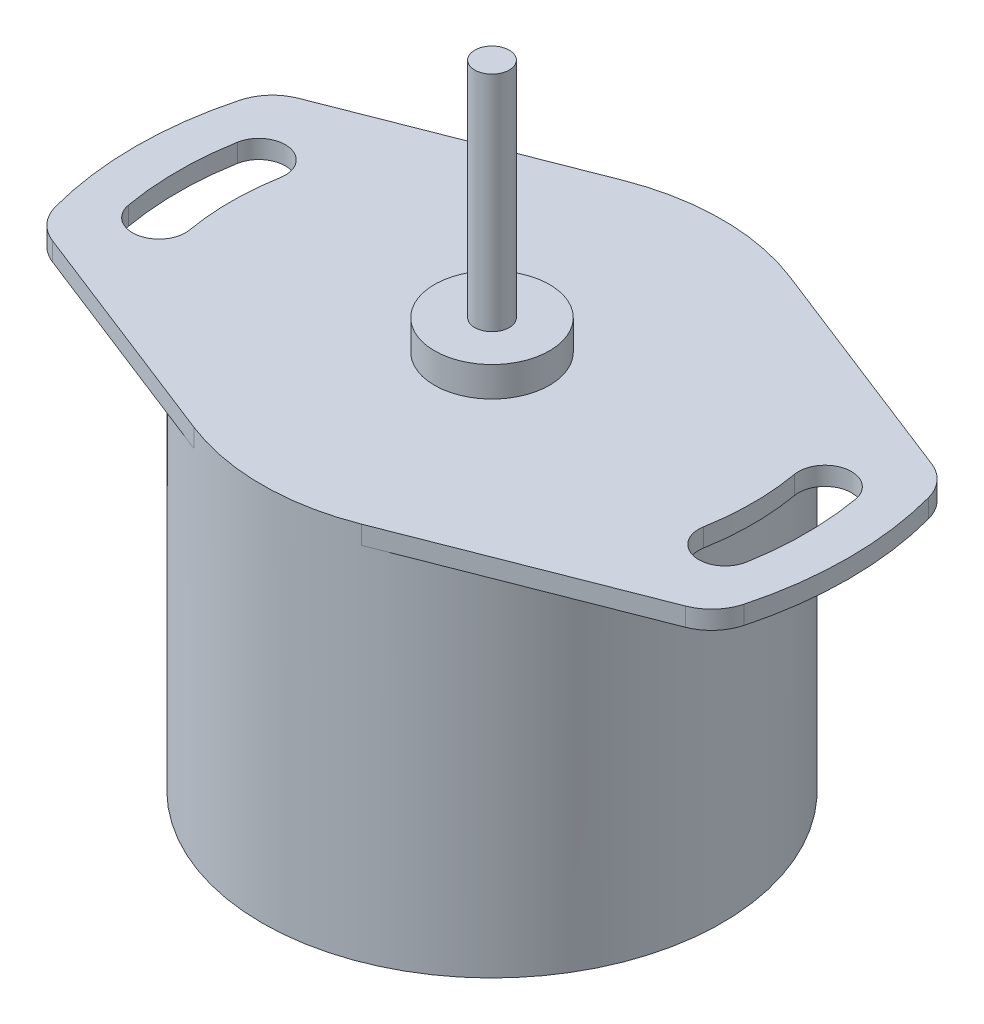
ISO-10303-21;
HEADER;
FILE_DESCRIPTION(('STEP AP214'),'2;1');
FILE_NAME('part.step','',(''),(''),'','','');
FILE_SCHEMA(('AUTOMOTIVE_DESIGN { 1 0 10303 214 1 1 1 1 }'));
ENDSEC;
DATA;
#1=APPLICATION_CONTEXT('core data for automotive mechanical design processes');
#2=APPLICATION_PROTOCOL_DEFINITION('international standard','automotive_design',2000,#1);
#3=PRODUCT_CONTEXT('',#1,'mechanical');
#4=PRODUCT('Part','Part','',(#3));
#5=PRODUCT_RELATED_PRODUCT_CATEGORY('part','',(#4));
#6=PRODUCT_DEFINITION_FORMATION('','',#4);
#7=PRODUCT_DEFINITION_CONTEXT('part definition',#1,'design');
#8=PRODUCT_DEFINITION('design','',#6,#7);
#9=PRODUCT_DEFINITION_SHAPE('','',#8);
#10=(LENGTH_UNIT() NAMED_UNIT(*) SI_UNIT(.MILLI.,.METRE.));
#11=(NAMED_UNIT(*) PLANE_ANGLE_UNIT() SI_UNIT($,.RADIAN.));
#12=(NAMED_UNIT(*) SI_UNIT($,.STERADIAN.) SOLID_ANGLE_UNIT());
#13=UNCERTAINTY_MEASURE_WITH_UNIT(LENGTH_MEASURE(1.E-05),#10,'distance_accuracy_value','');
#14=(GEOMETRIC_REPRESENTATION_CONTEXT(3) GLOBAL_UNCERTAINTY_ASSIGNED_CONTEXT((#13)) GLOBAL_UNIT_ASSIGNED_CONTEXT((#10,
#11,#12)) REPRESENTATION_CONTEXT('',''));
#15=CARTESIAN_POINT('',(0.,0.,0.));
#16=DIRECTION('',(0.,0.,1.));
#17=DIRECTION('',(1.,0.,0.));
#18=AXIS2_PLACEMENT_3D('',#15,#16,#17);
#19=CARTESIAN_POINT('',(0.,-1.3,0.));
#20=DIRECTION('',(0.,-1.,0.));
#21=DIRECTION('',(0.,0.,-1.));
#22=AXIS2_PLACEMENT_3D('',#19,#20,#21);
#23=PLANE('',#22);
#24=CARTESIAN_POINT('',(0.,-1.3,0.));
#25=DIRECTION('',(0.,-1.,0.));
#26=DIRECTION('',(0.,0.,-1.));
#27=AXIS2_PLACEMENT_3D('',#24,#25,#26);
#28=CIRCLE('',#27,3.);
#29=CARTESIAN_POINT('',(0.,-1.3,-3.));
#30=VERTEX_POINT('',#29);
#31=EDGE_CURVE('E278',#30,#30,#28,.T.);
#32=ORIENTED_EDGE('',*,*,#31,.T.);
#33=EDGE_LOOP('',(#32));
#34=FACE_BOUND('',#33,.T.);
#35=CARTESIAN_POINT('',(0.,-1.3,0.));
#36=DIRECTION('',(0.,-1.,0.));
#37=DIRECTION('',(0.,0.,-1.));
#38=AXIS2_PLACEMENT_3D('',#35,#36,#37);
#39=CIRCLE('',#38,0.75);
#40=CARTESIAN_POINT('',(0.,-1.3,-0.75));
#41=VERTEX_POINT('',#40);
#42=EDGE_CURVE('E612',#41,#41,#39,.T.);
#43=ORIENTED_EDGE('',*,*,#42,.F.);
#44=EDGE_LOOP('',(#43));
#45=FACE_BOUND('',#44,.T.);
#46=ADVANCED_FACE('F33',(#34,#45),#23,.T.);
#47=CARTESIAN_POINT('',(0.,17.8,0.));
#48=DIRECTION('',(0.,1.,0.));
#49=DIRECTION('',(0.,0.,1.));
#50=AXIS2_PLACEMENT_3D('',#47,#48,#49);
#51=PLANE('',#50);
#52=CARTESIAN_POINT('',(0.,17.8,0.));
#53=DIRECTION('',(0.,1.,0.));
#54=DIRECTION('',(0.,0.,1.));
#55=AXIS2_PLACEMENT_3D('',#52,#53,#54);
#56=CIRCLE('',#55,2.5);
#57=CARTESIAN_POINT('',(0.,17.8,2.5));
#58=VERTEX_POINT('',#57);
#59=EDGE_CURVE('E207',#58,#58,#56,.T.);
#60=ORIENTED_EDGE('',*,*,#59,.T.);
#61=EDGE_LOOP('',(#60));
#62=FACE_BOUND('',#61,.T.);
#63=CARTESIAN_POINT('',(0.,17.8,0.));
#64=DIRECTION('',(0.,1.,0.));
#65=DIRECTION('',(0.,0.,1.));
#66=AXIS2_PLACEMENT_3D('',#63,#64,#65);
#67=CIRCLE('',#66,0.75);
#68=CARTESIAN_POINT('',(0.,17.8,0.75));
#69=VERTEX_POINT('',#68);
#70=EDGE_CURVE('E611',#69,#69,#67,.T.);
#71=ORIENTED_EDGE('',*,*,#70,.F.);
#72=EDGE_LOOP('',(#71));
#73=FACE_BOUND('',#72,.T.);
#74=ADVANCED_FACE('F416',(#62,#73),#51,.T.);
#75=CARTESIAN_POINT('',(0.,16.5,0.));
#76=DIRECTION('',(0.,1.,0.));
#77=DIRECTION('',(0.,0.,1.));
#78=AXIS2_PLACEMENT_3D('',#75,#76,#77);
#79=PLANE('',#78);
#80=CARTESIAN_POINT('',(0.,16.5,0.));
#81=DIRECTION('',(0.,1.,0.));
#82=DIRECTION('',(0.,0.,1.));
#83=AXIS2_PLACEMENT_3D('',#80,#81,#82);
#84=CIRCLE('',#83,13.65);
#85=CARTESIAN_POINT('',(13.4426258286167,16.5,2.3702976251536));
#86=VERTEX_POINT('',#85);
#87=CARTESIAN_POINT('',(13.4426258286167,16.5,-2.37029762515359));
#88=VERTEX_POINT('',#87);
#89=EDGE_CURVE('E183',#86,#88,#84,.T.);
#90=ORIENTED_EDGE('',*,*,#89,.F.);
#91=CARTESIAN_POINT('',(12.3100969126526,16.5,2.17060222083662));
#92=DIRECTION('',(0.,1.,0.));
#93=DIRECTION('',(0.,0.,1.));
#94=AXIS2_PLACEMENT_3D('',#91,#92,#93);
#95=CIRCLE('',#94,1.15000000000001);
#96=CARTESIAN_POINT('',(11.1775679966886,16.5,1.97090681651966));
#97=VERTEX_POINT('',#96);
#98=EDGE_CURVE('E173',#97,#86,#95,.T.);
#99=ORIENTED_EDGE('',*,*,#98,.F.);
#100=CARTESIAN_POINT('',(0.,16.5,0.));
#101=DIRECTION('',(0.,-1.,0.));
#102=DIRECTION('',(0.,0.,1.));
#103=AXIS2_PLACEMENT_3D('',#100,#101,#102);
#104=CIRCLE('',#103,11.35);
#105=CARTESIAN_POINT('',(11.1775679966886,16.5,-1.97090681651965));
#106=VERTEX_POINT('',#105);
#107=EDGE_CURVE('E200',#106,#97,#104,.T.);
#108=ORIENTED_EDGE('',*,*,#107,.F.);
#109=CARTESIAN_POINT('',(12.3100969126526,16.5,-2.17060222083662));
#110=DIRECTION('',(0.,1.,0.));
#111=DIRECTION('',(0.,0.,1.));
#112=AXIS2_PLACEMENT_3D('',#109,#110,#111);
#113=CIRCLE('',#112,1.15000000000001);
#114=EDGE_CURVE('E198',#88,#106,#113,.T.);
#115=ORIENTED_EDGE('',*,*,#114,.F.);
#116=EDGE_LOOP('',(#90,#99,#108,#115));
#117=FACE_BOUND('',#116,.T.);
#118=DIRECTION('',(-0.93131854557357,0.,0.364205665346835));
#119=VECTOR('',#118,1.);
#120=CARTESIAN_POINT('',(-14.6714007511212,16.5,-5.));
#121=LINE('',#120,#119);
#122=CARTESIAN_POINT('',(-3.64205665346834,16.5,-9.3131854557357));
#123=VERTEX_POINT('',#122);
#124=CARTESIAN_POINT('',(-13.7694767638018,16.5,-5.3527104957323));
#125=VERTEX_POINT('',#124);
#126=EDGE_CURVE('E267',#123,#125,#121,.T.);
#127=ORIENTED_EDGE('',*,*,#126,.T.);
#128=CARTESIAN_POINT('',(-13.0410654331081,16.5,-3.49007340458517));
#129=DIRECTION('',(0.,1.,0.));
#130=DIRECTION('',(0.,0.,1.));
#131=AXIS2_PLACEMENT_3D('',#128,#129,#130);
#132=CIRCLE('',#131,2.);
#133=CARTESIAN_POINT('',(-14.9730751269019,16.5,-4.00712131637556));
#134=VERTEX_POINT('',#133);
#135=EDGE_CURVE('E328',#125,#134,#132,.T.);
#136=ORIENTED_EDGE('',*,*,#135,.T.);
#137=CARTESIAN_POINT('',(0.,16.5,0.));
#138=DIRECTION('',(0.,1.,0.));
#139=DIRECTION('',(0.,0.,1.));
#140=AXIS2_PLACEMENT_3D('',#137,#138,#139);
#141=CIRCLE('',#140,15.5);
#142=CARTESIAN_POINT('',(-14.9730751269019,16.5,4.00712131637556));
#143=VERTEX_POINT('',#142);
#144=EDGE_CURVE('E249',#134,#143,#141,.T.);
#145=ORIENTED_EDGE('',*,*,#144,.T.);
#146=CARTESIAN_POINT('',(-13.0410654331081,16.5,3.49007340458517));
#147=DIRECTION('',(0.,1.,0.));
#148=DIRECTION('',(0.,0.,1.));
#149=AXIS2_PLACEMENT_3D('',#146,#147,#148);
#150=CIRCLE('',#149,2.);
#151=CARTESIAN_POINT('',(-13.7694767638018,16.5,5.3527104957323));
#152=VERTEX_POINT('',#151);
#153=EDGE_CURVE('E322',#143,#152,#150,.T.);
#154=ORIENTED_EDGE('',*,*,#153,.T.);
#155=DIRECTION('',(0.93131854557357,0.,0.364205665346835));
#156=VECTOR('',#155,1.);
#157=CARTESIAN_POINT('',(-14.6714007511212,16.5,5.));
#158=LINE('',#157,#156);
#159=CARTESIAN_POINT('',(-3.64205665346834,16.5,9.3131854557357));
#160=VERTEX_POINT('',#159);
#161=EDGE_CURVE('E252',#152,#160,#158,.T.);
#162=ORIENTED_EDGE('',*,*,#161,.T.);
#163=CARTESIAN_POINT('',(0.,16.5,0.));
#164=DIRECTION('',(0.,1.,0.));
#165=DIRECTION('',(0.,0.,-1.));
#166=AXIS2_PLACEMENT_3D('',#163,#164,#165);
#167=CIRCLE('',#166,10.);
#168=CARTESIAN_POINT('',(3.64205665346835,16.5,9.3131854557357));
#169=VERTEX_POINT('',#168);
#170=EDGE_CURVE('E255',#160,#169,#167,.T.);
#171=ORIENTED_EDGE('',*,*,#170,.T.);
#172=DIRECTION('',(0.93131854557357,0.,-0.364205665346835));
#173=VECTOR('',#172,1.);
#174=CARTESIAN_POINT('',(14.6714007511212,16.5,5.));
#175=LINE('',#174,#173);
#176=CARTESIAN_POINT('',(13.7694767638018,16.5,5.3527104957323));
#177=VERTEX_POINT('',#176);
#178=EDGE_CURVE('E257',#169,#177,#175,.T.);
#179=ORIENTED_EDGE('',*,*,#178,.T.);
#180=CARTESIAN_POINT('',(13.0410654331081,16.5,3.49007340458517));
#181=DIRECTION('',(0.,1.,0.));
#182=DIRECTION('',(0.,0.,1.));
#183=AXIS2_PLACEMENT_3D('',#180,#181,#182);
#184=CIRCLE('',#183,2.);
#185=CARTESIAN_POINT('',(14.9730751269019,16.5,4.00712131637556));
#186=VERTEX_POINT('',#185);
#187=EDGE_CURVE('E324',#177,#186,#184,.T.);
#188=ORIENTED_EDGE('',*,*,#187,.T.);
#189=CARTESIAN_POINT('',(0.,16.5,0.));
#190=DIRECTION('',(0.,1.,0.));
#191=DIRECTION('',(0.,0.,-1.));
#192=AXIS2_PLACEMENT_3D('',#189,#190,#191);
#193=CIRCLE('',#192,15.5);
#194=CARTESIAN_POINT('',(14.9730751269019,16.5,-4.00712131637556));
#195=VERTEX_POINT('',#194);
#196=EDGE_CURVE('E260',#186,#195,#193,.T.);
#197=ORIENTED_EDGE('',*,*,#196,.T.);
#198=CARTESIAN_POINT('',(13.0410654331081,16.5,-3.49007340458517));
#199=DIRECTION('',(0.,1.,0.));
#200=DIRECTION('',(0.,0.,1.));
#201=AXIS2_PLACEMENT_3D('',#198,#199,#200);
#202=CIRCLE('',#201,2.);
#203=CARTESIAN_POINT('',(13.7694767638018,16.5,-5.3527104957323));
#204=VERTEX_POINT('',#203);
#205=EDGE_CURVE('E326',#195,#204,#202,.T.);
#206=ORIENTED_EDGE('',*,*,#205,.T.);
#207=DIRECTION('',(-0.93131854557357,0.,-0.364205665346835));
#208=VECTOR('',#207,1.);
#209=CARTESIAN_POINT('',(3.64205665346835,16.5,-9.3131854557357));
#210=LINE('',#209,#208);
#211=CARTESIAN_POINT('',(3.64205665346835,16.5,-9.3131854557357));
#212=VERTEX_POINT('',#211);
#213=EDGE_CURVE('E263',#204,#212,#210,.T.);
#214=ORIENTED_EDGE('',*,*,#213,.T.);
#215=CARTESIAN_POINT('',(0.,16.5,0.));
#216=DIRECTION('',(0.,1.,0.));
#217=DIRECTION('',(0.,0.,-1.));
#218=AXIS2_PLACEMENT_3D('',#215,#216,#217);
#219=CIRCLE('',#218,10.);
#220=EDGE_CURVE('E265',#212,#123,#219,.T.);
#221=ORIENTED_EDGE('',*,*,#220,.T.);
#222=EDGE_LOOP('',(#127,#136,#145,#154,#162,#171,#179,#188,#197,#206,#214,#221));
#223=FACE_BOUND('',#222,.T.);
#224=CARTESIAN_POINT('',(0.,16.5,0.));
#225=DIRECTION('',(0.,1.,0.));
#226=DIRECTION('',(0.,0.,1.));
#227=AXIS2_PLACEMENT_3D('',#224,#225,#226);
#228=CIRCLE('',#227,13.65);
#229=CARTESIAN_POINT('',(-13.4426258286166,16.5,-2.37029762515361));
#230=VERTEX_POINT('',#229);
#231=CARTESIAN_POINT('',(-13.4426258286166,16.5,2.37029762515361));
#232=VERTEX_POINT('',#231);
#233=EDGE_CURVE('E220',#230,#232,#228,.T.);
#234=ORIENTED_EDGE('',*,*,#233,.F.);
#235=CARTESIAN_POINT('',(-12.3100969126526,16.5,-2.17060222083664));
#236=DIRECTION('',(0.,1.,0.));
#237=DIRECTION('',(0.,0.,1.));
#238=AXIS2_PLACEMENT_3D('',#235,#236,#237);
#239=CIRCLE('',#238,1.15);
#240=CARTESIAN_POINT('',(-11.1775679966886,16.5,-1.97090681651967));
#241=VERTEX_POINT('',#240);
#242=EDGE_CURVE('E218',#241,#230,#239,.T.);
#243=ORIENTED_EDGE('',*,*,#242,.F.);
#244=CARTESIAN_POINT('',(0.,16.5,0.));
#245=DIRECTION('',(0.,-1.,0.));
#246=DIRECTION('',(0.,0.,1.));
#247=AXIS2_PLACEMENT_3D('',#244,#245,#246);
#248=CIRCLE('',#247,11.35);
#249=CARTESIAN_POINT('',(-11.1775679966886,16.5,1.97090681651966));
#250=VERTEX_POINT('',#249);
#251=EDGE_CURVE('E226',#250,#241,#248,.T.);
#252=ORIENTED_EDGE('',*,*,#251,.F.);
#253=CARTESIAN_POINT('',(-12.3100969126526,16.5,2.17060222083664));
#254=DIRECTION('',(0.,1.,0.));
#255=DIRECTION('',(0.,0.,1.));
#256=AXIS2_PLACEMENT_3D('',#253,#254,#255);
#257=CIRCLE('',#256,1.15);
#258=EDGE_CURVE('E223',#232,#250,#257,.T.);
#259=ORIENTED_EDGE('',*,*,#258,.F.);
#260=EDGE_LOOP('',(#234,#243,#252,#259));
#261=FACE_BOUND('',#260,.T.);
#262=CARTESIAN_POINT('',(0.,16.5,0.));
#263=DIRECTION('',(0.,1.,0.));
#264=DIRECTION('',(0.,0.,1.));
#265=AXIS2_PLACEMENT_3D('',#262,#263,#264);
#266=CIRCLE('',#265,2.5);
#267=CARTESIAN_POINT('',(0.,16.5,2.5));
#268=VERTEX_POINT('',#267);
#269=EDGE_CURVE('E621',#268,#268,#266,.T.);
#270=ORIENTED_EDGE('',*,*,#269,.F.);
#271=EDGE_LOOP('',(#270));
#272=FACE_BOUND('',#271,.T.);
#273=ADVANCED_FACE('F195',(#117,#223,#261,#272),#79,.T.);
#274=CARTESIAN_POINT('',(0.,0.,0.));
#275=DIRECTION('',(0.,1.,0.));
#276=DIRECTION('',(0.,0.,1.));
#277=AXIS2_PLACEMENT_3D('',#274,#275,#276);
#278=PLANE('',#277);
#279=CARTESIAN_POINT('',(0.,0.,0.));
#280=DIRECTION('',(0.,1.,0.));
#281=DIRECTION('',(0.,0.,1.));
#282=AXIS2_PLACEMENT_3D('',#279,#280,#281);
#283=CIRCLE('',#282,10.);
#284=CARTESIAN_POINT('',(0.,0.,10.));
#285=VERTEX_POINT('',#284);
#286=EDGE_CURVE('E281',#285,#285,#283,.T.);
#287=ORIENTED_EDGE('',*,*,#286,.F.);
#288=EDGE_LOOP('',(#287));
#289=FACE_BOUND('',#288,.T.);
#290=CARTESIAN_POINT('',(0.,0.,0.));
#291=DIRECTION('',(0.,1.,0.));
#292=DIRECTION('',(0.,0.,1.));
#293=AXIS2_PLACEMENT_3D('',#290,#291,#292);
#294=CIRCLE('',#293,3.);
#295=CARTESIAN_POINT('',(0.,0.,3.));
#296=VERTEX_POINT('',#295);
#297=EDGE_CURVE('E286',#296,#296,#294,.F.);
#298=ORIENTED_EDGE('',*,*,#297,.F.);
#299=EDGE_LOOP('',(#298));
#300=FACE_BOUND('',#299,.T.);
#301=ADVANCED_FACE('F432',(#289,#300),#278,.F.);
#302=CARTESIAN_POINT('',(0.,15.7,0.));
#303=DIRECTION('',(0.,-1.,0.));
#304=DIRECTION('',(0.,0.,-1.));
#305=AXIS2_PLACEMENT_3D('',#302,#303,#304);
#306=CYLINDRICAL_SURFACE('',#305,10.);
#307=CARTESIAN_POINT('',(0.,15.7,0.));
#308=DIRECTION('',(0.,1.,0.));
#309=DIRECTION('',(0.,0.,1.));
#310=AXIS2_PLACEMENT_3D('',#307,#308,#309);
#311=CIRCLE('',#310,10.);
#312=CARTESIAN_POINT('',(3.64205665346835,15.7,9.3131854557357));
#313=VERTEX_POINT('',#312);
#314=CARTESIAN_POINT('',(3.64205665346835,15.7,-9.3131854557357));
#315=VERTEX_POINT('',#314);
#316=EDGE_CURVE('E290',#313,#315,#311,.T.);
#317=ORIENTED_EDGE('',*,*,#316,.F.);
#318=DIRECTION('',(0.,-1.,0.));
#319=VECTOR('',#318,1.);
#320=CARTESIAN_POINT('',(3.64205665346835,16.5,9.3131854557357));
#321=LINE('',#320,#319);
#322=EDGE_CURVE('E298',#169,#313,#321,.T.);
#323=ORIENTED_EDGE('',*,*,#322,.F.);
#324=ORIENTED_EDGE('',*,*,#170,.F.);
#325=DIRECTION('',(0.,-1.,0.));
#326=VECTOR('',#325,1.);
#327=CARTESIAN_POINT('',(-3.64205665346834,16.5,9.3131854557357));
#328=LINE('',#327,#326);
#329=CARTESIAN_POINT('',(-3.64205665346835,15.7,9.3131854557357));
#330=VERTEX_POINT('',#329);
#331=EDGE_CURVE('E282',#160,#330,#328,.T.);
#332=ORIENTED_EDGE('',*,*,#331,.T.);
#333=CARTESIAN_POINT('',(-3.64205665346835,15.7,-9.3131854557357));
#334=VERTEX_POINT('',#333);
#335=EDGE_CURVE('E285',#334,#330,#311,.T.);
#336=ORIENTED_EDGE('',*,*,#335,.F.);
#337=DIRECTION('',(0.,-1.,0.));
#338=VECTOR('',#337,1.);
#339=CARTESIAN_POINT('',(-3.64205665346834,16.5,-9.3131854557357));
#340=LINE('',#339,#338);
#341=EDGE_CURVE('E270',#123,#334,#340,.T.);
#342=ORIENTED_EDGE('',*,*,#341,.F.);
#343=ORIENTED_EDGE('',*,*,#220,.F.);
#344=DIRECTION('',(0.,-1.,0.));
#345=VECTOR('',#344,1.);
#346=CARTESIAN_POINT('',(3.64205665346835,16.5,-9.3131854557357));
#347=LINE('',#346,#345);
#348=EDGE_CURVE('E301',#212,#315,#347,.T.);
#349=ORIENTED_EDGE('',*,*,#348,.T.);
#350=EDGE_LOOP('',(#317,#323,#324,#332,#336,#342,#343,#349));
#351=FACE_BOUND('',#350,.T.);
#352=ORIENTED_EDGE('',*,*,#286,.T.);
#353=EDGE_LOOP('',(#352));
#354=FACE_BOUND('',#353,.T.);
#355=ADVANCED_FACE('F379',(#351,#354),#306,.T.);
#356=CARTESIAN_POINT('',(0.,-1.3,0.));
#357=DIRECTION('',(0.,1.,0.));
#358=DIRECTION('',(0.,0.,1.));
#359=AXIS2_PLACEMENT_3D('',#356,#357,#358);
#360=CYLINDRICAL_SURFACE('',#359,3.);
#361=ORIENTED_EDGE('',*,*,#31,.F.);
#362=EDGE_LOOP('',(#361));
#363=FACE_BOUND('',#362,.T.);
#364=ORIENTED_EDGE('',*,*,#297,.T.);
#365=EDGE_LOOP('',(#364));
#366=FACE_BOUND('',#365,.T.);
#367=ADVANCED_FACE('F428',(#363,#366),#360,.T.);
#368=CARTESIAN_POINT('',(0.,15.7,0.));
#369=DIRECTION('',(0.,1.,0.));
#370=DIRECTION('',(0.,0.,1.));
#371=AXIS2_PLACEMENT_3D('',#368,#369,#370);
#372=PLANE('',#371);
#373=CARTESIAN_POINT('',(12.3100969126526,15.7,2.17060222083662));
#374=DIRECTION('',(0.,1.,0.));
#375=DIRECTION('',(0.,0.,1.));
#376=AXIS2_PLACEMENT_3D('',#373,#374,#375);
#377=CIRCLE('',#376,1.15000000000001);
#378=CARTESIAN_POINT('',(11.1775679966886,15.7,1.97090681651966));
#379=VERTEX_POINT('',#378);
#380=CARTESIAN_POINT('',(13.4426258286167,15.7,2.3702976251536));
#381=VERTEX_POINT('',#380);
#382=EDGE_CURVE('E205',#379,#381,#377,.T.);
#383=ORIENTED_EDGE('',*,*,#382,.T.);
#384=CARTESIAN_POINT('',(0.,15.7,0.));
#385=DIRECTION('',(0.,1.,0.));
#386=DIRECTION('',(0.,0.,1.));
#387=AXIS2_PLACEMENT_3D('',#384,#385,#386);
#388=CIRCLE('',#387,13.65);
#389=CARTESIAN_POINT('',(13.4426258286167,15.7,-2.37029762515359));
#390=VERTEX_POINT('',#389);
#391=EDGE_CURVE('E190',#381,#390,#388,.T.);
#392=ORIENTED_EDGE('',*,*,#391,.T.);
#393=CARTESIAN_POINT('',(12.3100969126526,15.7,-2.17060222083662));
#394=DIRECTION('',(0.,1.,0.));
#395=DIRECTION('',(0.,0.,1.));
#396=AXIS2_PLACEMENT_3D('',#393,#394,#395);
#397=CIRCLE('',#396,1.15000000000001);
#398=CARTESIAN_POINT('',(11.1775679966886,15.7,-1.97090681651965));
#399=VERTEX_POINT('',#398);
#400=EDGE_CURVE('E209',#390,#399,#397,.T.);
#401=ORIENTED_EDGE('',*,*,#400,.T.);
#402=CARTESIAN_POINT('',(0.,15.7,0.));
#403=DIRECTION('',(0.,-1.,0.));
#404=DIRECTION('',(0.,0.,1.));
#405=AXIS2_PLACEMENT_3D('',#402,#403,#404);
#406=CIRCLE('',#405,11.35);
#407=EDGE_CURVE('E184',#399,#379,#406,.T.);
#408=ORIENTED_EDGE('',*,*,#407,.T.);
#409=EDGE_LOOP('',(#383,#392,#401,#408));
#410=FACE_BOUND('',#409,.T.);
#411=DIRECTION('',(-0.93131854557357,0.,-0.364205665346835));
#412=VECTOR('',#411,1.);
#413=CARTESIAN_POINT('',(3.64205665346835,15.7,-9.3131854557357));
#414=LINE('',#413,#412);
#415=CARTESIAN_POINT('',(13.7694767638018,15.7,-5.3527104957323));
#416=VERTEX_POINT('',#415);
#417=EDGE_CURVE('E276',#416,#315,#414,.T.);
#418=ORIENTED_EDGE('',*,*,#417,.F.);
#419=CARTESIAN_POINT('',(13.0410654331081,15.7,-3.49007340458517));
#420=DIRECTION('',(0.,1.,0.));
#421=DIRECTION('',(0.,0.,1.));
#422=AXIS2_PLACEMENT_3D('',#419,#420,#421);
#423=CIRCLE('',#422,2.);
#424=CARTESIAN_POINT('',(14.9730751269019,15.7,-4.00712131637556));
#425=VERTEX_POINT('',#424);
#426=EDGE_CURVE('E48',#416,#425,#423,.F.);
#427=ORIENTED_EDGE('',*,*,#426,.T.);
#428=CARTESIAN_POINT('',(0.,15.7,0.));
#429=DIRECTION('',(0.,1.,0.));
#430=DIRECTION('',(0.,0.,-1.));
#431=AXIS2_PLACEMENT_3D('',#428,#429,#430);
#432=CIRCLE('',#431,15.5);
#433=CARTESIAN_POINT('',(14.9730751269019,15.7,4.00712131637556));
#434=VERTEX_POINT('',#433);
#435=EDGE_CURVE('E274',#434,#425,#432,.T.);
#436=ORIENTED_EDGE('',*,*,#435,.F.);
#437=CARTESIAN_POINT('',(13.0410654331081,15.7,3.49007340458517));
#438=DIRECTION('',(0.,1.,0.));
#439=DIRECTION('',(0.,0.,1.));
#440=AXIS2_PLACEMENT_3D('',#437,#438,#439);
#441=CIRCLE('',#440,2.);
#442=CARTESIAN_POINT('',(13.7694767638018,15.7,5.3527104957323));
#443=VERTEX_POINT('',#442);
#444=EDGE_CURVE('E56',#434,#443,#441,.F.);
#445=ORIENTED_EDGE('',*,*,#444,.T.);
#446=DIRECTION('',(0.93131854557357,0.,-0.364205665346835));
#447=VECTOR('',#446,1.);
#448=CARTESIAN_POINT('',(14.6714007511212,15.7,5.));
#449=LINE('',#448,#447);
#450=EDGE_CURVE('E277',#313,#443,#449,.T.);
#451=ORIENTED_EDGE('',*,*,#450,.F.);
#452=ORIENTED_EDGE('',*,*,#316,.T.);
#453=EDGE_LOOP('',(#418,#427,#436,#445,#451,#452));
#454=FACE_BOUND('',#453,.T.);
#455=ADVANCED_FACE('F402',(#410,#454),#372,.F.);
#456=CARTESIAN_POINT('',(-12.3100969126526,15.7,-2.17060222083664));
#457=DIRECTION('',(0.,1.,0.));
#458=DIRECTION('',(0.,0.,1.));
#459=AXIS2_PLACEMENT_3D('',#456,#457,#458);
#460=CIRCLE('',#459,1.15);
#461=CARTESIAN_POINT('',(-11.1775679966886,15.7,-1.97090681651967));
#462=VERTEX_POINT('',#461);
#463=CARTESIAN_POINT('',(-13.4426258286166,15.7,-2.37029762515361));
#464=VERTEX_POINT('',#463);
#465=EDGE_CURVE('E191',#462,#464,#460,.T.);
#466=ORIENTED_EDGE('',*,*,#465,.T.);
#467=CARTESIAN_POINT('',(0.,15.7,0.));
#468=DIRECTION('',(0.,1.,0.));
#469=DIRECTION('',(0.,0.,1.));
#470=AXIS2_PLACEMENT_3D('',#467,#468,#469);
#471=CIRCLE('',#470,13.65);
#472=CARTESIAN_POINT('',(-13.4426258286166,15.7,2.37029762515361));
#473=VERTEX_POINT('',#472);
#474=EDGE_CURVE('E231',#464,#473,#471,.T.);
#475=ORIENTED_EDGE('',*,*,#474,.T.);
#476=CARTESIAN_POINT('',(-12.3100969126526,15.7,2.17060222083664));
#477=DIRECTION('',(0.,1.,0.));
#478=DIRECTION('',(0.,0.,1.));
#479=AXIS2_PLACEMENT_3D('',#476,#477,#478);
#480=CIRCLE('',#479,1.15);
#481=CARTESIAN_POINT('',(-11.1775679966886,15.7,1.97090681651967));
#482=VERTEX_POINT('',#481);
#483=EDGE_CURVE('E234',#473,#482,#480,.T.);
#484=ORIENTED_EDGE('',*,*,#483,.T.);
#485=CARTESIAN_POINT('',(0.,15.7,0.));
#486=DIRECTION('',(0.,-1.,0.));
#487=DIRECTION('',(0.,0.,1.));
#488=AXIS2_PLACEMENT_3D('',#485,#486,#487);
#489=CIRCLE('',#488,11.35);
#490=EDGE_CURVE('E221',#482,#462,#489,.T.);
#491=ORIENTED_EDGE('',*,*,#490,.T.);
#492=EDGE_LOOP('',(#466,#475,#484,#491));
#493=FACE_BOUND('',#492,.T.);
#494=CARTESIAN_POINT('',(0.,15.7,0.));
#495=DIRECTION('',(0.,1.,0.));
#496=DIRECTION('',(0.,0.,1.));
#497=AXIS2_PLACEMENT_3D('',#494,#495,#496);
#498=CIRCLE('',#497,15.5);
#499=CARTESIAN_POINT('',(-14.9730751269019,15.7,-4.00712131637556));
#500=VERTEX_POINT('',#499);
#501=CARTESIAN_POINT('',(-14.9730751269019,15.7,4.00712131637556));
#502=VERTEX_POINT('',#501);
#503=EDGE_CURVE('E248',#500,#502,#498,.T.);
#504=ORIENTED_EDGE('',*,*,#503,.F.);
#505=CARTESIAN_POINT('',(-13.0410654331081,15.7,-3.49007340458517));
#506=DIRECTION('',(0.,1.,0.));
#507=DIRECTION('',(0.,0.,1.));
#508=AXIS2_PLACEMENT_3D('',#505,#506,#507);
#509=CIRCLE('',#508,2.);
#510=CARTESIAN_POINT('',(-13.7694767638018,15.7,-5.3527104957323));
#511=VERTEX_POINT('',#510);
#512=EDGE_CURVE('E318',#500,#511,#509,.F.);
#513=ORIENTED_EDGE('',*,*,#512,.T.);
#514=DIRECTION('',(-0.93131854557357,0.,0.364205665346835));
#515=VECTOR('',#514,1.);
#516=CARTESIAN_POINT('',(-14.6714007511212,15.7,-5.));
#517=LINE('',#516,#515);
#518=EDGE_CURVE('E253',#334,#511,#517,.T.);
#519=ORIENTED_EDGE('',*,*,#518,.F.);
#520=ORIENTED_EDGE('',*,*,#335,.T.);
#521=DIRECTION('',(0.93131854557357,0.,0.364205665346835));
#522=VECTOR('',#521,1.);
#523=CARTESIAN_POINT('',(-14.6714007511212,15.7,5.));
#524=LINE('',#523,#522);
#525=CARTESIAN_POINT('',(-13.7694767638018,15.7,5.3527104957323));
#526=VERTEX_POINT('',#525);
#527=EDGE_CURVE('E273',#526,#330,#524,.T.);
#528=ORIENTED_EDGE('',*,*,#527,.F.);
#529=CARTESIAN_POINT('',(-13.0410654331081,15.7,3.49007340458517));
#530=DIRECTION('',(0.,1.,0.));
#531=DIRECTION('',(0.,0.,1.));
#532=AXIS2_PLACEMENT_3D('',#529,#530,#531);
#533=CIRCLE('',#532,2.);
#534=EDGE_CURVE('E316',#526,#502,#533,.F.);
#535=ORIENTED_EDGE('',*,*,#534,.T.);
#536=EDGE_LOOP('',(#504,#513,#519,#520,#528,#535));
#537=FACE_BOUND('',#536,.T.);
#538=ADVANCED_FACE('F352',(#493,#537),#372,.F.);
#539=CARTESIAN_POINT('',(0.,16.5,0.));
#540=DIRECTION('',(0.,-1.,0.));
#541=DIRECTION('',(0.,0.,-1.));
#542=AXIS2_PLACEMENT_3D('',#539,#540,#541);
#543=CYLINDRICAL_SURFACE('',#542,15.5);
#544=ORIENTED_EDGE('',*,*,#144,.F.);
#545=DIRECTION('',(0.,-1.,0.));
#546=VECTOR('',#545,1.);
#547=CARTESIAN_POINT('',(-14.9730751269019,16.5,-4.00712131637556));
#548=LINE('',#547,#546);
#549=EDGE_CURVE('E314',#134,#500,#548,.T.);
#550=ORIENTED_EDGE('',*,*,#549,.T.);
#551=ORIENTED_EDGE('',*,*,#503,.T.);
#552=DIRECTION('',(0.,-1.,0.));
#553=VECTOR('',#552,1.);
#554=CARTESIAN_POINT('',(-14.9730751269019,16.5,4.00712131637556));
#555=LINE('',#554,#553);
#556=EDGE_CURVE('E289',#502,#143,#555,.F.);
#557=ORIENTED_EDGE('',*,*,#556,.T.);
#558=EDGE_LOOP('',(#544,#550,#551,#557));
#559=FACE_BOUND('',#558,.T.);
#560=ADVANCED_FACE('F348',(#559),#543,.T.);
#561=CARTESIAN_POINT('',(-14.6714007511212,16.5,5.));
#562=DIRECTION('',(0.364205665346835,0.,-0.93131854557357));
#563=DIRECTION('',(-0.93131854557357,0.,-0.364205665346835));
#564=AXIS2_PLACEMENT_3D('',#561,#562,#563);
#565=PLANE('',#564);
#566=ORIENTED_EDGE('',*,*,#161,.F.);
#567=DIRECTION('',(0.,-1.,0.));
#568=VECTOR('',#567,1.);
#569=CARTESIAN_POINT('',(-13.7694767638018,16.5,5.3527104957323));
#570=LINE('',#569,#568);
#571=EDGE_CURVE('E11',#152,#526,#570,.T.);
#572=ORIENTED_EDGE('',*,*,#571,.T.);
#573=ORIENTED_EDGE('',*,*,#527,.T.);
#574=ORIENTED_EDGE('',*,*,#331,.F.);
#575=EDGE_LOOP('',(#566,#572,#573,#574));
#576=FACE_BOUND('',#575,.T.);
#577=ADVANCED_FACE('F361',(#576),#565,.F.);
#578=CARTESIAN_POINT('',(14.6714007511212,16.5,5.));
#579=DIRECTION('',(-0.364205665346835,0.,-0.93131854557357));
#580=DIRECTION('',(-0.93131854557357,0.,0.364205665346835));
#581=AXIS2_PLACEMENT_3D('',#578,#579,#580);
#582=PLANE('',#581);
#583=ORIENTED_EDGE('',*,*,#450,.T.);
#584=DIRECTION('',(0.,-1.,0.));
#585=VECTOR('',#584,1.);
#586=CARTESIAN_POINT('',(13.7694767638018,16.5,5.3527104957323));
#587=LINE('',#586,#585);
#588=EDGE_CURVE('E41',#443,#177,#587,.F.);
#589=ORIENTED_EDGE('',*,*,#588,.T.);
#590=ORIENTED_EDGE('',*,*,#178,.F.);
#591=ORIENTED_EDGE('',*,*,#322,.T.);
#592=EDGE_LOOP('',(#583,#589,#590,#591));
#593=FACE_BOUND('',#592,.T.);
#594=ADVANCED_FACE('F384',(#593),#582,.F.);
#595=CARTESIAN_POINT('',(0.,16.5,0.));
#596=DIRECTION('',(0.,-1.,0.));
#597=DIRECTION('',(0.,0.,-1.));
#598=AXIS2_PLACEMENT_3D('',#595,#596,#597);
#599=CYLINDRICAL_SURFACE('',#598,15.5);
#600=ORIENTED_EDGE('',*,*,#435,.T.);
#601=DIRECTION('',(0.,-1.,0.));
#602=VECTOR('',#601,1.);
#603=CARTESIAN_POINT('',(14.9730751269019,16.5,-4.00712131637556));
#604=LINE('',#603,#602);
#605=EDGE_CURVE('E390',#425,#195,#604,.F.);
#606=ORIENTED_EDGE('',*,*,#605,.T.);
#607=ORIENTED_EDGE('',*,*,#196,.F.);
#608=DIRECTION('',(0.,-1.,0.));
#609=VECTOR('',#608,1.);
#610=CARTESIAN_POINT('',(14.9730751269019,16.5,4.00712131637556));
#611=LINE('',#610,#609);
#612=EDGE_CURVE('E388',#186,#434,#611,.T.);
#613=ORIENTED_EDGE('',*,*,#612,.T.);
#614=EDGE_LOOP('',(#600,#606,#607,#613));
#615=FACE_BOUND('',#614,.T.);
#616=ADVANCED_FACE('F406',(#615),#599,.T.);
#617=CARTESIAN_POINT('',(3.64205665346835,16.5,-9.3131854557357));
#618=DIRECTION('',(-0.364205665346835,0.,0.93131854557357));
#619=DIRECTION('',(0.93131854557357,0.,0.364205665346835));
#620=AXIS2_PLACEMENT_3D('',#617,#618,#619);
#621=PLANE('',#620);
#622=ORIENTED_EDGE('',*,*,#213,.F.);
#623=DIRECTION('',(0.,-1.,0.));
#624=VECTOR('',#623,1.);
#625=CARTESIAN_POINT('',(13.7694767638018,16.5,-5.35271049573231));
#626=LINE('',#625,#624);
#627=EDGE_CURVE('E330',#204,#416,#626,.T.);
#628=ORIENTED_EDGE('',*,*,#627,.T.);
#629=ORIENTED_EDGE('',*,*,#417,.T.);
#630=ORIENTED_EDGE('',*,*,#348,.F.);
#631=EDGE_LOOP('',(#622,#628,#629,#630));
#632=FACE_BOUND('',#631,.T.);
#633=ADVANCED_FACE('F398',(#632),#621,.F.);
#634=CARTESIAN_POINT('',(-14.6714007511212,16.5,-5.));
#635=DIRECTION('',(0.364205665346835,0.,0.93131854557357));
#636=DIRECTION('',(0.93131854557357,0.,-0.364205665346835));
#637=AXIS2_PLACEMENT_3D('',#634,#635,#636);
#638=PLANE('',#637);
#639=ORIENTED_EDGE('',*,*,#518,.T.);
#640=DIRECTION('',(0.,-1.,0.));
#641=VECTOR('',#640,1.);
#642=CARTESIAN_POINT('',(-13.7694767638018,16.5,-5.3527104957323));
#643=LINE('',#642,#641);
#644=EDGE_CURVE('E320',#511,#125,#643,.F.);
#645=ORIENTED_EDGE('',*,*,#644,.T.);
#646=ORIENTED_EDGE('',*,*,#126,.F.);
#647=ORIENTED_EDGE('',*,*,#341,.T.);
#648=EDGE_LOOP('',(#639,#645,#646,#647));
#649=FACE_BOUND('',#648,.T.);
#650=ADVANCED_FACE('F371',(#649),#638,.F.);
#651=CARTESIAN_POINT('',(-12.3100969126526,16.5,-2.17060222083664));
#652=DIRECTION('',(0.,-1.,0.));
#653=DIRECTION('',(0.,0.,-1.));
#654=AXIS2_PLACEMENT_3D('',#651,#652,#653);
#655=CYLINDRICAL_SURFACE('',#654,1.15);
#656=ORIENTED_EDGE('',*,*,#465,.F.);
#657=DIRECTION('',(0.,-1.,0.));
#658=VECTOR('',#657,1.);
#659=CARTESIAN_POINT('',(-11.1775679966886,16.5,-1.97090681651967));
#660=LINE('',#659,#658);
#661=EDGE_CURVE('E228',#241,#462,#660,.T.);
#662=ORIENTED_EDGE('',*,*,#661,.F.);
#663=ORIENTED_EDGE('',*,*,#242,.T.);
#664=DIRECTION('',(0.,-1.,0.));
#665=VECTOR('',#664,1.);
#666=CARTESIAN_POINT('',(-13.4426258286166,16.5,-2.37029762515361));
#667=LINE('',#666,#665);
#668=EDGE_CURVE('E245',#230,#464,#667,.T.);
#669=ORIENTED_EDGE('',*,*,#668,.T.);
#670=EDGE_LOOP('',(#656,#662,#663,#669));
#671=FACE_BOUND('',#670,.T.);
#672=ADVANCED_FACE('F484',(#671),#655,.F.);
#673=CARTESIAN_POINT('',(0.,16.5,0.));
#674=DIRECTION('',(0.,-1.,0.));
#675=DIRECTION('',(0.,0.,-1.));
#676=AXIS2_PLACEMENT_3D('',#673,#674,#675);
#677=CYLINDRICAL_SURFACE('',#676,13.65);
#678=ORIENTED_EDGE('',*,*,#474,.F.);
#679=ORIENTED_EDGE('',*,*,#668,.F.);
#680=ORIENTED_EDGE('',*,*,#233,.T.);
#681=DIRECTION('',(0.,-1.,0.));
#682=VECTOR('',#681,1.);
#683=CARTESIAN_POINT('',(-13.4426258286166,16.5,2.37029762515361));
#684=LINE('',#683,#682);
#685=EDGE_CURVE('E243',#232,#473,#684,.T.);
#686=ORIENTED_EDGE('',*,*,#685,.T.);
#687=EDGE_LOOP('',(#678,#679,#680,#686));
#688=FACE_BOUND('',#687,.T.);
#689=ADVANCED_FACE('F480',(#688),#677,.F.);
#690=CARTESIAN_POINT('',(-12.3100969126526,16.5,2.17060222083664));
#691=DIRECTION('',(0.,-1.,0.));
#692=DIRECTION('',(0.,0.,-1.));
#693=AXIS2_PLACEMENT_3D('',#690,#691,#692);
#694=CYLINDRICAL_SURFACE('',#693,1.15);
#695=ORIENTED_EDGE('',*,*,#483,.F.);
#696=ORIENTED_EDGE('',*,*,#685,.F.);
#697=ORIENTED_EDGE('',*,*,#258,.T.);
#698=DIRECTION('',(0.,-1.,0.));
#699=VECTOR('',#698,1.);
#700=CARTESIAN_POINT('',(-11.1775679966886,16.5,1.97090681651967));
#701=LINE('',#700,#699);
#702=EDGE_CURVE('E241',#250,#482,#701,.T.);
#703=ORIENTED_EDGE('',*,*,#702,.T.);
#704=EDGE_LOOP('',(#695,#696,#697,#703));
#705=FACE_BOUND('',#704,.T.);
#706=ADVANCED_FACE('F476',(#705),#694,.F.);
#707=CARTESIAN_POINT('',(0.,16.5,0.));
#708=DIRECTION('',(0.,-1.,0.));
#709=DIRECTION('',(0.,0.,-1.));
#710=AXIS2_PLACEMENT_3D('',#707,#708,#709);
#711=CYLINDRICAL_SURFACE('',#710,11.35);
#712=ORIENTED_EDGE('',*,*,#490,.F.);
#713=ORIENTED_EDGE('',*,*,#702,.F.);
#714=ORIENTED_EDGE('',*,*,#251,.T.);
#715=ORIENTED_EDGE('',*,*,#661,.T.);
#716=EDGE_LOOP('',(#712,#713,#714,#715));
#717=FACE_BOUND('',#716,.T.);
#718=ADVANCED_FACE('F473',(#717),#711,.T.);
#719=CARTESIAN_POINT('',(12.3100969126526,16.5,2.17060222083662));
#720=DIRECTION('',(0.,-1.,0.));
#721=DIRECTION('',(0.,0.,-1.));
#722=AXIS2_PLACEMENT_3D('',#719,#720,#721);
#723=CYLINDRICAL_SURFACE('',#722,1.15000000000001);
#724=ORIENTED_EDGE('',*,*,#382,.F.);
#725=DIRECTION('',(0.,-1.,0.));
#726=VECTOR('',#725,1.);
#727=CARTESIAN_POINT('',(11.1775679966886,16.5,1.97090681651966));
#728=LINE('',#727,#726);
#729=EDGE_CURVE('E179',#97,#379,#728,.T.);
#730=ORIENTED_EDGE('',*,*,#729,.F.);
#731=ORIENTED_EDGE('',*,*,#98,.T.);
#732=DIRECTION('',(0.,-1.,0.));
#733=VECTOR('',#732,1.);
#734=CARTESIAN_POINT('',(13.4426258286167,16.5,2.3702976251536));
#735=LINE('',#734,#733);
#736=EDGE_CURVE('E176',#86,#381,#735,.T.);
#737=ORIENTED_EDGE('',*,*,#736,.T.);
#738=EDGE_LOOP('',(#724,#730,#731,#737));
#739=FACE_BOUND('',#738,.T.);
#740=ADVANCED_FACE('F175',(#739),#723,.F.);
#741=CARTESIAN_POINT('',(0.,16.5,0.));
#742=DIRECTION('',(0.,-1.,0.));
#743=DIRECTION('',(0.,0.,-1.));
#744=AXIS2_PLACEMENT_3D('',#741,#742,#743);
#745=CYLINDRICAL_SURFACE('',#744,13.65);
#746=ORIENTED_EDGE('',*,*,#391,.F.);
#747=ORIENTED_EDGE('',*,*,#736,.F.);
#748=ORIENTED_EDGE('',*,*,#89,.T.);
#749=DIRECTION('',(0.,-1.,0.));
#750=VECTOR('',#749,1.);
#751=CARTESIAN_POINT('',(13.4426258286167,16.5,-2.37029762515359));
#752=LINE('',#751,#750);
#753=EDGE_CURVE('E192',#88,#390,#752,.T.);
#754=ORIENTED_EDGE('',*,*,#753,.T.);
#755=EDGE_LOOP('',(#746,#747,#748,#754));
#756=FACE_BOUND('',#755,.T.);
#757=ADVANCED_FACE('F187',(#756),#745,.F.);
#758=CARTESIAN_POINT('',(12.3100969126526,16.5,-2.17060222083662));
#759=DIRECTION('',(0.,-1.,0.));
#760=DIRECTION('',(0.,0.,-1.));
#761=AXIS2_PLACEMENT_3D('',#758,#759,#760);
#762=CYLINDRICAL_SURFACE('',#761,1.15000000000001);
#763=ORIENTED_EDGE('',*,*,#400,.F.);
#764=ORIENTED_EDGE('',*,*,#753,.F.);
#765=ORIENTED_EDGE('',*,*,#114,.T.);
#766=DIRECTION('',(0.,-1.,0.));
#767=VECTOR('',#766,1.);
#768=CARTESIAN_POINT('',(11.1775679966886,16.5,-1.97090681651965));
#769=LINE('',#768,#767);
#770=EDGE_CURVE('E215',#106,#399,#769,.T.);
#771=ORIENTED_EDGE('',*,*,#770,.T.);
#772=EDGE_LOOP('',(#763,#764,#765,#771));
#773=FACE_BOUND('',#772,.T.);
#774=ADVANCED_FACE('F464',(#773),#762,.F.);
#775=CARTESIAN_POINT('',(0.,16.5,0.));
#776=DIRECTION('',(0.,-1.,0.));
#777=DIRECTION('',(0.,0.,-1.));
#778=AXIS2_PLACEMENT_3D('',#775,#776,#777);
#779=CYLINDRICAL_SURFACE('',#778,11.35);
#780=ORIENTED_EDGE('',*,*,#407,.F.);
#781=ORIENTED_EDGE('',*,*,#770,.F.);
#782=ORIENTED_EDGE('',*,*,#107,.T.);
#783=ORIENTED_EDGE('',*,*,#729,.T.);
#784=EDGE_LOOP('',(#780,#781,#782,#783));
#785=FACE_BOUND('',#784,.T.);
#786=ADVANCED_FACE('F440',(#785),#779,.T.);
#787=CARTESIAN_POINT('',(-13.0410654331081,16.5,-3.49007340458517));
#788=DIRECTION('',(0.,-1.,0.));
#789=DIRECTION('',(0.,0.,-1.));
#790=AXIS2_PLACEMENT_3D('',#787,#788,#789);
#791=CYLINDRICAL_SURFACE('',#790,2.);
#792=ORIENTED_EDGE('',*,*,#135,.F.);
#793=ORIENTED_EDGE('',*,*,#644,.F.);
#794=ORIENTED_EDGE('',*,*,#512,.F.);
#795=ORIENTED_EDGE('',*,*,#549,.F.);
#796=EDGE_LOOP('',(#792,#793,#794,#795));
#797=FACE_BOUND('',#796,.T.);
#798=ADVANCED_FACE('F369',(#797),#791,.T.);
#799=CARTESIAN_POINT('',(13.0410654331081,16.5,-3.49007340458517));
#800=DIRECTION('',(0.,-1.,0.));
#801=DIRECTION('',(0.,0.,-1.));
#802=AXIS2_PLACEMENT_3D('',#799,#800,#801);
#803=CYLINDRICAL_SURFACE('',#802,2.);
#804=ORIENTED_EDGE('',*,*,#205,.F.);
#805=ORIENTED_EDGE('',*,*,#605,.F.);
#806=ORIENTED_EDGE('',*,*,#426,.F.);
#807=ORIENTED_EDGE('',*,*,#627,.F.);
#808=EDGE_LOOP('',(#804,#805,#806,#807));
#809=FACE_BOUND('',#808,.T.);
#810=ADVANCED_FACE('F405',(#809),#803,.T.);
#811=CARTESIAN_POINT('',(13.0410654331081,16.5,3.49007340458517));
#812=DIRECTION('',(0.,-1.,0.));
#813=DIRECTION('',(0.,0.,-1.));
#814=AXIS2_PLACEMENT_3D('',#811,#812,#813);
#815=CYLINDRICAL_SURFACE('',#814,2.);
#816=ORIENTED_EDGE('',*,*,#187,.F.);
#817=ORIENTED_EDGE('',*,*,#588,.F.);
#818=ORIENTED_EDGE('',*,*,#444,.F.);
#819=ORIENTED_EDGE('',*,*,#612,.F.);
#820=EDGE_LOOP('',(#816,#817,#818,#819));
#821=FACE_BOUND('',#820,.T.);
#822=ADVANCED_FACE('F387',(#821),#815,.T.);
#823=CARTESIAN_POINT('',(-13.0410654331081,16.5,3.49007340458517));
#824=DIRECTION('',(0.,-1.,0.));
#825=DIRECTION('',(0.,0.,-1.));
#826=AXIS2_PLACEMENT_3D('',#823,#824,#825);
#827=CYLINDRICAL_SURFACE('',#826,2.);
#828=ORIENTED_EDGE('',*,*,#153,.F.);
#829=ORIENTED_EDGE('',*,*,#556,.F.);
#830=ORIENTED_EDGE('',*,*,#534,.F.);
#831=ORIENTED_EDGE('',*,*,#571,.F.);
#832=EDGE_LOOP('',(#828,#829,#830,#831));
#833=FACE_BOUND('',#832,.T.);
#834=ADVANCED_FACE('F35',(#833),#827,.T.);
#835=CARTESIAN_POINT('',(0.,17.8,0.));
#836=DIRECTION('',(0.,-1.,0.));
#837=DIRECTION('',(0.,0.,-1.));
#838=AXIS2_PLACEMENT_3D('',#835,#836,#837);
#839=CYLINDRICAL_SURFACE('',#838,2.5);
#840=ORIENTED_EDGE('',*,*,#59,.F.);
#841=EDGE_LOOP('',(#840));
#842=FACE_BOUND('',#841,.T.);
#843=ORIENTED_EDGE('',*,*,#269,.T.);
#844=EDGE_LOOP('',(#843));
#845=FACE_BOUND('',#844,.T.);
#846=ADVANCED_FACE('F446',(#842,#845),#839,.T.);
#847=CARTESIAN_POINT('',(0.,27.5,0.));
#848=DIRECTION('',(0.,-1.,0.));
#849=DIRECTION('',(0.,0.,-1.));
#850=AXIS2_PLACEMENT_3D('',#847,#848,#849);
#851=CYLINDRICAL_SURFACE('',#850,0.75);
#852=CARTESIAN_POINT('',(0.,27.5,0.));
#853=DIRECTION('',(0.,1.,0.));
#854=DIRECTION('',(0.,0.,1.));
#855=AXIS2_PLACEMENT_3D('',#852,#853,#854);
#856=CIRCLE('',#855,0.75);
#857=CARTESIAN_POINT('',(0.,27.5,0.75));
#858=VERTEX_POINT('',#857);
#859=EDGE_CURVE('E615',#858,#858,#856,.T.);
#860=ORIENTED_EDGE('',*,*,#859,.F.);
#861=EDGE_LOOP('',(#860));
#862=FACE_BOUND('',#861,.T.);
#863=ORIENTED_EDGE('',*,*,#70,.T.);
#864=EDGE_LOOP('',(#863));
#865=FACE_BOUND('',#864,.T.);
#866=ADVANCED_FACE('F450',(#862,#865),#851,.T.);
#867=CARTESIAN_POINT('',(0.,27.5,0.));
#868=DIRECTION('',(0.,1.,0.));
#869=DIRECTION('',(0.,0.,1.));
#870=AXIS2_PLACEMENT_3D('',#867,#868,#869);
#871=PLANE('',#870);
#872=ORIENTED_EDGE('',*,*,#859,.T.);
#873=EDGE_LOOP('',(#872));
#874=FACE_BOUND('',#873,.T.);
#875=ADVANCED_FACE('F456',(#874),#871,.T.);
#876=CARTESIAN_POINT('',(0.,-2.5,0.));
#877=DIRECTION('',(0.,1.,0.));
#878=DIRECTION('',(0.,0.,1.));
#879=AXIS2_PLACEMENT_3D('',#876,#877,#878);
#880=CYLINDRICAL_SURFACE('',#879,0.75);
#881=CARTESIAN_POINT('',(0.,-2.5,0.));
#882=DIRECTION('',(0.,-1.,0.));
#883=DIRECTION('',(0.,0.,-1.));
#884=AXIS2_PLACEMENT_3D('',#881,#882,#883);
#885=CIRCLE('',#884,0.75);
#886=CARTESIAN_POINT('',(0.,-2.5,-0.75));
#887=VERTEX_POINT('',#886);
#888=EDGE_CURVE('E610',#887,#887,#885,.T.);
#889=ORIENTED_EDGE('',*,*,#888,.F.);
#890=EDGE_LOOP('',(#889));
#891=FACE_BOUND('',#890,.T.);
#892=ORIENTED_EDGE('',*,*,#42,.T.);
#893=EDGE_LOOP('',(#892));
#894=FACE_BOUND('',#893,.T.);
#895=ADVANCED_FACE('F579',(#891,#894),#880,.T.);
#896=CARTESIAN_POINT('',(0.,-2.5,0.));
#897=DIRECTION('',(0.,-1.,0.));
#898=DIRECTION('',(0.,0.,-1.));
#899=AXIS2_PLACEMENT_3D('',#896,#897,#898);
#900=PLANE('',#899);
#901=ORIENTED_EDGE('',*,*,#888,.T.);
#902=EDGE_LOOP('',(#901));
#903=FACE_BOUND('',#902,.T.);
#904=ADVANCED_FACE('F594',(#903),#900,.T.);
#905=CLOSED_SHELL('',(#46,#74,#273,#301,#355,#367,#455,#538,#560,#577,#594,#616,#633,#650,#672,
#689,#706,#718,#740,#757,#774,#786,#798,#810,#822,#834,#846,#866,#875,#895,#904));
#906=MANIFOLD_SOLID_BREP('B2',#905);
#907=ADVANCED_BREP_SHAPE_REPRESENTATION('',(#18,#906),#14);
#908=SHAPE_DEFINITION_REPRESENTATION(#9,#907);
ENDSEC;
END-ISO-10303-21;
